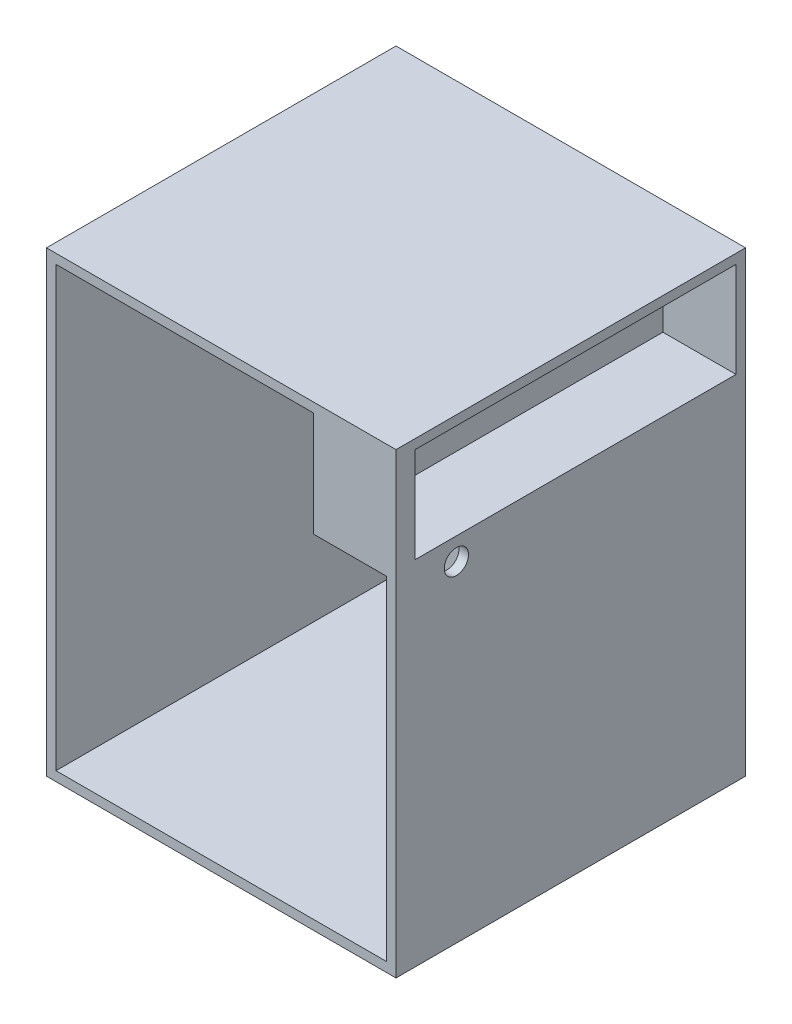
ISO-10303-21;
HEADER;
FILE_DESCRIPTION(('STEP AP214'),'2;1');
FILE_NAME('part.step','',(''),(''),'','','');
FILE_SCHEMA(('AUTOMOTIVE_DESIGN { 1 0 10303 214 1 1 1 1 }'));
ENDSEC;
DATA;
#1=APPLICATION_CONTEXT('core data for automotive mechanical design processes');
#2=APPLICATION_PROTOCOL_DEFINITION('international standard','automotive_design',2000,#1);
#3=PRODUCT_CONTEXT('',#1,'mechanical');
#4=PRODUCT('Part','Part','',(#3));
#5=PRODUCT_RELATED_PRODUCT_CATEGORY('part','',(#4));
#6=PRODUCT_DEFINITION_FORMATION('','',#4);
#7=PRODUCT_DEFINITION_CONTEXT('part definition',#1,'design');
#8=PRODUCT_DEFINITION('design','',#6,#7);
#9=PRODUCT_DEFINITION_SHAPE('','',#8);
#10=(LENGTH_UNIT() NAMED_UNIT(*) SI_UNIT(.MILLI.,.METRE.));
#11=(NAMED_UNIT(*) PLANE_ANGLE_UNIT() SI_UNIT($,.RADIAN.));
#12=(NAMED_UNIT(*) SI_UNIT($,.STERADIAN.) SOLID_ANGLE_UNIT());
#13=UNCERTAINTY_MEASURE_WITH_UNIT(LENGTH_MEASURE(1.E-05),#10,'distance_accuracy_value','');
#14=(GEOMETRIC_REPRESENTATION_CONTEXT(3) GLOBAL_UNCERTAINTY_ASSIGNED_CONTEXT((#13)) GLOBAL_UNIT_ASSIGNED_CONTEXT((#10,
#11,#12)) REPRESENTATION_CONTEXT('',''));
#15=CARTESIAN_POINT('',(0.,0.,0.));
#16=DIRECTION('',(0.,0.,1.));
#17=DIRECTION('',(1.,0.,0.));
#18=AXIS2_PLACEMENT_3D('',#15,#16,#17);
#19=CARTESIAN_POINT('',(260.,720.,275.));
#20=DIRECTION('',(-1.,0.,0.));
#21=DIRECTION('',(0.,0.,1.));
#22=AXIS2_PLACEMENT_3D('',#19,#20,#21);
#23=PLANE('',#22);
#24=DIRECTION('',(0.,0.,1.));
#25=VECTOR('',#24,1.);
#26=CARTESIAN_POINT('',(260.,555.,-260.));
#27=LINE('',#26,#25);
#28=CARTESIAN_POINT('',(260.,555.,245.));
#29=VERTEX_POINT('',#28);
#30=CARTESIAN_POINT('',(260.,555.,260.));
#31=VERTEX_POINT('',#30);
#32=EDGE_CURVE('E175',#29,#31,#27,.T.);
#33=ORIENTED_EDGE('',*,*,#32,.T.);
#34=DIRECTION('',(0.,1.,0.));
#35=VECTOR('',#34,1.);
#36=CARTESIAN_POINT('',(260.,705.,260.));
#37=LINE('',#36,#35);
#38=CARTESIAN_POINT('',(260.,705.,260.));
#39=VERTEX_POINT('',#38);
#40=EDGE_CURVE('E62',#31,#39,#37,.T.);
#41=ORIENTED_EDGE('',*,*,#40,.T.);
#42=DIRECTION('',(0.,0.,-1.));
#43=VECTOR('',#42,1.);
#44=CARTESIAN_POINT('',(260.,705.,275.));
#45=LINE('',#44,#43);
#46=CARTESIAN_POINT('',(260.,705.,245.));
#47=VERTEX_POINT('',#46);
#48=EDGE_CURVE('E172',#39,#47,#45,.T.);
#49=ORIENTED_EDGE('',*,*,#48,.T.);
#50=DIRECTION('',(0.,1.,0.));
#51=VECTOR('',#50,1.);
#52=CARTESIAN_POINT('',(260.,720.,245.));
#53=LINE('',#52,#51);
#54=EDGE_CURVE('E281',#29,#47,#53,.T.);
#55=ORIENTED_EDGE('',*,*,#54,.F.);
#56=EDGE_LOOP('',(#33,#41,#49,#55));
#57=FACE_BOUND('',#56,.T.);
#58=ADVANCED_FACE('F44',(#57),#23,.T.);
#59=CARTESIAN_POINT('',(0.,705.,0.));
#60=DIRECTION('',(0.,1.,0.));
#61=DIRECTION('',(0.,0.,1.));
#62=AXIS2_PLACEMENT_3D('',#59,#60,#61);
#63=PLANE('',#62);
#64=DIRECTION('',(-1.,0.,0.));
#65=VECTOR('',#64,1.);
#66=CARTESIAN_POINT('',(260.,705.,260.));
#67=LINE('',#66,#65);
#68=CARTESIAN_POINT('',(160.,705.,260.));
#69=VERTEX_POINT('',#68);
#70=EDGE_CURVE('E158',#39,#69,#67,.T.);
#71=ORIENTED_EDGE('',*,*,#70,.T.);
#72=DIRECTION('',(0.,0.,1.));
#73=VECTOR('',#72,1.);
#74=CARTESIAN_POINT('',(160.,705.,-260.));
#75=LINE('',#74,#73);
#76=CARTESIAN_POINT('',(160.,705.,-260.));
#77=VERTEX_POINT('',#76);
#78=EDGE_CURVE('E309',#77,#69,#75,.T.);
#79=ORIENTED_EDGE('',*,*,#78,.F.);
#80=DIRECTION('',(-1.,0.,0.));
#81=VECTOR('',#80,1.);
#82=CARTESIAN_POINT('',(275.,705.,-260.));
#83=LINE('',#82,#81);
#84=CARTESIAN_POINT('',(275.,705.,-260.));
#85=VERTEX_POINT('',#84);
#86=EDGE_CURVE('E188',#85,#77,#83,.T.);
#87=ORIENTED_EDGE('',*,*,#86,.F.);
#88=DIRECTION('',(0.,0.,1.));
#89=VECTOR('',#88,1.);
#90=CARTESIAN_POINT('',(275.,705.,245.));
#91=LINE('',#90,#89);
#92=CARTESIAN_POINT('',(275.,705.,245.));
#93=VERTEX_POINT('',#92);
#94=EDGE_CURVE('E275',#85,#93,#91,.T.);
#95=ORIENTED_EDGE('',*,*,#94,.T.);
#96=DIRECTION('',(1.,0.,0.));
#97=VECTOR('',#96,1.);
#98=CARTESIAN_POINT('',(-366.806416058119,705.,245.));
#99=LINE('',#98,#97);
#100=EDGE_CURVE('E181',#47,#93,#99,.T.);
#101=ORIENTED_EDGE('',*,*,#100,.F.);
#102=ORIENTED_EDGE('',*,*,#48,.F.);
#103=EDGE_LOOP('',(#71,#79,#87,#95,#101,#102));
#104=FACE_BOUND('',#103,.T.);
#105=ADVANCED_FACE('F179',(#104),#63,.F.);
#106=CARTESIAN_POINT('',(160.,705.,-260.));
#107=DIRECTION('',(1.,0.,0.));
#108=DIRECTION('',(0.,1.,0.));
#109=AXIS2_PLACEMENT_3D('',#106,#107,#108);
#110=PLANE('',#109);
#111=ORIENTED_EDGE('',*,*,#78,.T.);
#112=DIRECTION('',(0.,1.,0.));
#113=VECTOR('',#112,1.);
#114=CARTESIAN_POINT('',(160.,705.,260.));
#115=LINE('',#114,#113);
#116=CARTESIAN_POINT('',(160.,555.,260.));
#117=VERTEX_POINT('',#116);
#118=EDGE_CURVE('E161',#117,#69,#115,.T.);
#119=ORIENTED_EDGE('',*,*,#118,.F.);
#120=DIRECTION('',(0.,0.,1.));
#121=VECTOR('',#120,1.);
#122=CARTESIAN_POINT('',(160.,555.,-260.));
#123=LINE('',#122,#121);
#124=CARTESIAN_POINT('',(160.,555.,-260.));
#125=VERTEX_POINT('',#124);
#126=EDGE_CURVE('E312',#125,#117,#123,.T.);
#127=ORIENTED_EDGE('',*,*,#126,.F.);
#128=DIRECTION('',(0.,1.,0.));
#129=VECTOR('',#128,1.);
#130=CARTESIAN_POINT('',(160.,705.,-260.));
#131=LINE('',#130,#129);
#132=EDGE_CURVE('E299',#125,#77,#131,.T.);
#133=ORIENTED_EDGE('',*,*,#132,.T.);
#134=EDGE_LOOP('',(#111,#119,#127,#133));
#135=FACE_BOUND('',#134,.T.);
#136=ADVANCED_FACE('F390',(#135),#110,.T.);
#137=CARTESIAN_POINT('',(160.,555.,-260.));
#138=DIRECTION('',(0.,1.,0.));
#139=DIRECTION('',(0.,0.,1.));
#140=AXIS2_PLACEMENT_3D('',#137,#138,#139);
#141=PLANE('',#140);
#142=ORIENTED_EDGE('',*,*,#126,.T.);
#143=DIRECTION('',(-1.,0.,0.));
#144=VECTOR('',#143,1.);
#145=CARTESIAN_POINT('',(260.,555.,260.));
#146=LINE('',#145,#144);
#147=EDGE_CURVE('E167',#31,#117,#146,.T.);
#148=ORIENTED_EDGE('',*,*,#147,.F.);
#149=ORIENTED_EDGE('',*,*,#32,.F.);
#150=DIRECTION('',(1.,0.,0.));
#151=VECTOR('',#150,1.);
#152=CARTESIAN_POINT('',(-366.806416058119,555.,245.));
#153=LINE('',#152,#151);
#154=CARTESIAN_POINT('',(275.,555.,245.));
#155=VERTEX_POINT('',#154);
#156=EDGE_CURVE('E278',#29,#155,#153,.T.);
#157=ORIENTED_EDGE('',*,*,#156,.T.);
#158=DIRECTION('',(0.,0.,-1.));
#159=VECTOR('',#158,1.);
#160=CARTESIAN_POINT('',(275.,555.,245.));
#161=LINE('',#160,#159);
#162=CARTESIAN_POINT('',(275.,555.,-260.));
#163=VERTEX_POINT('',#162);
#164=EDGE_CURVE('E267',#155,#163,#161,.T.);
#165=ORIENTED_EDGE('',*,*,#164,.T.);
#166=DIRECTION('',(-1.,0.,0.));
#167=VECTOR('',#166,1.);
#168=CARTESIAN_POINT('',(160.,555.,-260.));
#169=LINE('',#168,#167);
#170=EDGE_CURVE('E295',#163,#125,#169,.T.);
#171=ORIENTED_EDGE('',*,*,#170,.T.);
#172=EDGE_LOOP('',(#142,#148,#149,#157,#165,#171));
#173=FACE_BOUND('',#172,.T.);
#174=ADVANCED_FACE('F444',(#173),#141,.T.);
#175=CARTESIAN_POINT('',(275.,720.,-260.));
#176=DIRECTION('',(0.,0.,1.));
#177=DIRECTION('',(1.,0.,0.));
#178=AXIS2_PLACEMENT_3D('',#175,#176,#177);
#179=PLANE('',#178);
#180=ORIENTED_EDGE('',*,*,#132,.F.);
#181=ORIENTED_EDGE('',*,*,#170,.F.);
#182=DIRECTION('',(0.,1.,0.));
#183=VECTOR('',#182,1.);
#184=CARTESIAN_POINT('',(275.,705.,-260.));
#185=LINE('',#184,#183);
#186=EDGE_CURVE('E271',#163,#85,#185,.T.);
#187=ORIENTED_EDGE('',*,*,#186,.T.);
#188=ORIENTED_EDGE('',*,*,#86,.T.);
#189=EDGE_LOOP('',(#180,#181,#187,#188));
#190=FACE_BOUND('',#189,.T.);
#191=ADVANCED_FACE('F400',(#190),#179,.T.);
#192=CARTESIAN_POINT('',(275.,720.,275.));
#193=DIRECTION('',(0.,0.,-1.));
#194=DIRECTION('',(-1.,0.,0.));
#195=AXIS2_PLACEMENT_3D('',#192,#193,#194);
#196=PLANE('',#195);
#197=DIRECTION('',(1.,0.,0.));
#198=VECTOR('',#197,1.);
#199=CARTESIAN_POINT('',(275.,0.,275.));
#200=LINE('',#199,#198);
#201=CARTESIAN_POINT('',(-275.,0.,275.));
#202=VERTEX_POINT('',#201);
#203=CARTESIAN_POINT('',(275.,0.,275.));
#204=VERTEX_POINT('',#203);
#205=EDGE_CURVE('E228',#202,#204,#200,.T.);
#206=ORIENTED_EDGE('',*,*,#205,.T.);
#207=DIRECTION('',(0.,-1.,0.));
#208=VECTOR('',#207,1.);
#209=CARTESIAN_POINT('',(275.,720.,275.));
#210=LINE('',#209,#208);
#211=CARTESIAN_POINT('',(275.,720.,275.));
#212=VERTEX_POINT('',#211);
#213=EDGE_CURVE('E54',#212,#204,#210,.T.);
#214=ORIENTED_EDGE('',*,*,#213,.F.);
#215=DIRECTION('',(1.,0.,0.));
#216=VECTOR('',#215,1.);
#217=CARTESIAN_POINT('',(275.,720.,275.));
#218=LINE('',#217,#216);
#219=CARTESIAN_POINT('',(-275.,720.,275.));
#220=VERTEX_POINT('',#219);
#221=EDGE_CURVE('E214',#220,#212,#218,.T.);
#222=ORIENTED_EDGE('',*,*,#221,.F.);
#223=DIRECTION('',(0.,-1.,0.));
#224=VECTOR('',#223,1.);
#225=CARTESIAN_POINT('',(-275.,720.,275.));
#226=LINE('',#225,#224);
#227=EDGE_CURVE('E11',#220,#202,#226,.T.);
#228=ORIENTED_EDGE('',*,*,#227,.T.);
#229=EDGE_LOOP('',(#206,#214,#222,#228));
#230=FACE_BOUND('',#229,.T.);
#231=DIRECTION('',(1.,0.,0.));
#232=VECTOR('',#231,1.);
#233=CARTESIAN_POINT('',(275.,15.,275.));
#234=LINE('',#233,#232);
#235=CARTESIAN_POINT('',(-260.,15.,275.));
#236=VERTEX_POINT('',#235);
#237=CARTESIAN_POINT('',(260.,15.,275.));
#238=VERTEX_POINT('',#237);
#239=EDGE_CURVE('E202',#236,#238,#234,.T.);
#240=ORIENTED_EDGE('',*,*,#239,.F.);
#241=DIRECTION('',(0.,-1.,0.));
#242=VECTOR('',#241,1.);
#243=CARTESIAN_POINT('',(-260.,720.,275.));
#244=LINE('',#243,#242);
#245=CARTESIAN_POINT('',(-260.,705.,275.));
#246=VERTEX_POINT('',#245);
#247=EDGE_CURVE('E197',#246,#236,#244,.T.);
#248=ORIENTED_EDGE('',*,*,#247,.F.);
#249=DIRECTION('',(1.,0.,0.));
#250=VECTOR('',#249,1.);
#251=CARTESIAN_POINT('',(275.,705.,275.));
#252=LINE('',#251,#250);
#253=CARTESIAN_POINT('',(145.,705.,275.));
#254=VERTEX_POINT('',#253);
#255=EDGE_CURVE('E184',#246,#254,#252,.T.);
#256=ORIENTED_EDGE('',*,*,#255,.T.);
#257=DIRECTION('',(0.,-1.,0.));
#258=VECTOR('',#257,1.);
#259=CARTESIAN_POINT('',(145.,705.,275.));
#260=LINE('',#259,#258);
#261=CARTESIAN_POINT('',(145.,540.,275.));
#262=VERTEX_POINT('',#261);
#263=EDGE_CURVE('E286',#254,#262,#260,.T.);
#264=ORIENTED_EDGE('',*,*,#263,.T.);
#265=DIRECTION('',(1.,0.,0.));
#266=VECTOR('',#265,1.);
#267=CARTESIAN_POINT('',(145.,540.,275.));
#268=LINE('',#267,#266);
#269=CARTESIAN_POINT('',(260.,540.,275.));
#270=VERTEX_POINT('',#269);
#271=EDGE_CURVE('E292',#262,#270,#268,.T.);
#272=ORIENTED_EDGE('',*,*,#271,.T.);
#273=DIRECTION('',(0.,-1.,0.));
#274=VECTOR('',#273,1.);
#275=CARTESIAN_POINT('',(260.,720.,275.));
#276=LINE('',#275,#274);
#277=EDGE_CURVE('E201',#270,#238,#276,.T.);
#278=ORIENTED_EDGE('',*,*,#277,.T.);
#279=EDGE_LOOP('',(#240,#248,#256,#264,#272,#278));
#280=FACE_BOUND('',#279,.T.);
#281=ADVANCED_FACE('F365',(#230,#280),#196,.F.);
#282=CARTESIAN_POINT('',(-275.,720.,275.));
#283=DIRECTION('',(1.,0.,0.));
#284=DIRECTION('',(0.,0.,-1.));
#285=AXIS2_PLACEMENT_3D('',#282,#283,#284);
#286=PLANE('',#285);
#287=CARTESIAN_POINT('',(-275.,520.,-180.));
#288=DIRECTION('',(-1.,0.,0.));
#289=DIRECTION('',(0.,0.,1.));
#290=AXIS2_PLACEMENT_3D('',#287,#288,#289);
#291=CIRCLE('',#290,19.05);
#292=CARTESIAN_POINT('',(-275.,520.,-160.95));
#293=VERTEX_POINT('',#292);
#294=EDGE_CURVE('E248',#293,#293,#291,.T.);
#295=ORIENTED_EDGE('',*,*,#294,.F.);
#296=EDGE_LOOP('',(#295));
#297=FACE_BOUND('',#296,.T.);
#298=DIRECTION('',(0.,0.,1.));
#299=VECTOR('',#298,1.);
#300=CARTESIAN_POINT('',(-275.,0.,275.));
#301=LINE('',#300,#299);
#302=CARTESIAN_POINT('',(-275.,0.,-275.));
#303=VERTEX_POINT('',#302);
#304=EDGE_CURVE('E200',#303,#202,#301,.T.);
#305=ORIENTED_EDGE('',*,*,#304,.T.);
#306=ORIENTED_EDGE('',*,*,#227,.F.);
#307=DIRECTION('',(0.,0.,1.));
#308=VECTOR('',#307,1.);
#309=CARTESIAN_POINT('',(-275.,720.,275.));
#310=LINE('',#309,#308);
#311=CARTESIAN_POINT('',(-275.,720.,-275.));
#312=VERTEX_POINT('',#311);
#313=EDGE_CURVE('E210',#312,#220,#310,.T.);
#314=ORIENTED_EDGE('',*,*,#313,.F.);
#315=DIRECTION('',(0.,-1.,0.));
#316=VECTOR('',#315,1.);
#317=CARTESIAN_POINT('',(-275.,720.,-275.));
#318=LINE('',#317,#316);
#319=EDGE_CURVE('E224',#312,#303,#318,.T.);
#320=ORIENTED_EDGE('',*,*,#319,.T.);
#321=EDGE_LOOP('',(#305,#306,#314,#320));
#322=FACE_BOUND('',#321,.T.);
#323=ADVANCED_FACE('F46',(#297,#322),#286,.F.);
#324=CARTESIAN_POINT('',(275.,720.,275.));
#325=DIRECTION('',(-1.,0.,0.));
#326=DIRECTION('',(0.,0.,1.));
#327=AXIS2_PLACEMENT_3D('',#324,#325,#326);
#328=PLANE('',#327);
#329=CARTESIAN_POINT('',(275.,520.,180.));
#330=DIRECTION('',(1.,0.,0.));
#331=DIRECTION('',(0.,0.,-1.));
#332=AXIS2_PLACEMENT_3D('',#329,#330,#331);
#333=CIRCLE('',#332,19.05);
#334=CARTESIAN_POINT('',(275.,520.,160.95));
#335=VERTEX_POINT('',#334);
#336=EDGE_CURVE('E260',#335,#335,#333,.T.);
#337=ORIENTED_EDGE('',*,*,#336,.F.);
#338=EDGE_LOOP('',(#337));
#339=FACE_BOUND('',#338,.T.);
#340=ORIENTED_EDGE('',*,*,#164,.F.);
#341=DIRECTION('',(0.,-1.,0.));
#342=VECTOR('',#341,1.);
#343=CARTESIAN_POINT('',(275.,705.,245.));
#344=LINE('',#343,#342);
#345=EDGE_CURVE('E70',#93,#155,#344,.T.);
#346=ORIENTED_EDGE('',*,*,#345,.F.);
#347=ORIENTED_EDGE('',*,*,#94,.F.);
#348=ORIENTED_EDGE('',*,*,#186,.F.);
#349=EDGE_LOOP('',(#340,#346,#347,#348));
#350=FACE_BOUND('',#349,.T.);
#351=DIRECTION('',(0.,0.,-1.));
#352=VECTOR('',#351,1.);
#353=CARTESIAN_POINT('',(275.,0.,275.));
#354=LINE('',#353,#352);
#355=CARTESIAN_POINT('',(275.,0.,-275.));
#356=VERTEX_POINT('',#355);
#357=EDGE_CURVE('E231',#204,#356,#354,.T.);
#358=ORIENTED_EDGE('',*,*,#357,.T.);
#359=DIRECTION('',(0.,-1.,0.));
#360=VECTOR('',#359,1.);
#361=CARTESIAN_POINT('',(275.,720.,-275.));
#362=LINE('',#361,#360);
#363=CARTESIAN_POINT('',(275.,720.,-275.));
#364=VERTEX_POINT('',#363);
#365=EDGE_CURVE('E239',#364,#356,#362,.T.);
#366=ORIENTED_EDGE('',*,*,#365,.F.);
#367=DIRECTION('',(0.,0.,-1.));
#368=VECTOR('',#367,1.);
#369=CARTESIAN_POINT('',(275.,720.,275.));
#370=LINE('',#369,#368);
#371=EDGE_CURVE('E218',#212,#364,#370,.T.);
#372=ORIENTED_EDGE('',*,*,#371,.F.);
#373=ORIENTED_EDGE('',*,*,#213,.T.);
#374=EDGE_LOOP('',(#358,#366,#372,#373));
#375=FACE_BOUND('',#374,.T.);
#376=ADVANCED_FACE('F414',(#339,#350,#375),#328,.F.);
#377=CARTESIAN_POINT('',(275.,720.,-275.));
#378=DIRECTION('',(0.,0.,1.));
#379=DIRECTION('',(1.,0.,0.));
#380=AXIS2_PLACEMENT_3D('',#377,#378,#379);
#381=PLANE('',#380);
#382=DIRECTION('',(-1.,0.,0.));
#383=VECTOR('',#382,1.);
#384=CARTESIAN_POINT('',(275.,0.,-275.));
#385=LINE('',#384,#383);
#386=EDGE_CURVE('E215',#356,#303,#385,.T.);
#387=ORIENTED_EDGE('',*,*,#386,.T.);
#388=ORIENTED_EDGE('',*,*,#319,.F.);
#389=DIRECTION('',(-1.,0.,0.));
#390=VECTOR('',#389,1.);
#391=CARTESIAN_POINT('',(275.,720.,-275.));
#392=LINE('',#391,#390);
#393=EDGE_CURVE('E221',#364,#312,#392,.T.);
#394=ORIENTED_EDGE('',*,*,#393,.F.);
#395=ORIENTED_EDGE('',*,*,#365,.T.);
#396=EDGE_LOOP('',(#387,#388,#394,#395));
#397=FACE_BOUND('',#396,.T.);
#398=ADVANCED_FACE('F416',(#397),#381,.F.);
#399=CARTESIAN_POINT('',(0.,720.,0.));
#400=DIRECTION('',(0.,1.,0.));
#401=DIRECTION('',(0.,0.,1.));
#402=AXIS2_PLACEMENT_3D('',#399,#400,#401);
#403=PLANE('',#402);
#404=ORIENTED_EDGE('',*,*,#313,.T.);
#405=ORIENTED_EDGE('',*,*,#221,.T.);
#406=ORIENTED_EDGE('',*,*,#371,.T.);
#407=ORIENTED_EDGE('',*,*,#393,.T.);
#408=EDGE_LOOP('',(#404,#405,#406,#407));
#409=FACE_BOUND('',#408,.T.);
#410=ADVANCED_FACE('F435',(#409),#403,.T.);
#411=CARTESIAN_POINT('',(0.,0.,0.));
#412=DIRECTION('',(0.,1.,0.));
#413=DIRECTION('',(0.,0.,1.));
#414=AXIS2_PLACEMENT_3D('',#411,#412,#413);
#415=PLANE('',#414);
#416=ORIENTED_EDGE('',*,*,#304,.F.);
#417=ORIENTED_EDGE('',*,*,#386,.F.);
#418=ORIENTED_EDGE('',*,*,#357,.F.);
#419=ORIENTED_EDGE('',*,*,#205,.F.);
#420=EDGE_LOOP('',(#416,#417,#418,#419));
#421=FACE_BOUND('',#420,.T.);
#422=ADVANCED_FACE('F402',(#421),#415,.F.);
#423=CARTESIAN_POINT('',(-260.,720.,275.));
#424=DIRECTION('',(1.,0.,0.));
#425=DIRECTION('',(0.,0.,-1.));
#426=AXIS2_PLACEMENT_3D('',#423,#424,#425);
#427=PLANE('',#426);
#428=CARTESIAN_POINT('',(-260.,520.,-180.));
#429=DIRECTION('',(1.,0.,0.));
#430=DIRECTION('',(0.,0.,-1.));
#431=AXIS2_PLACEMENT_3D('',#428,#429,#430);
#432=CIRCLE('',#431,19.05);
#433=CARTESIAN_POINT('',(-260.,520.,-199.05));
#434=VERTEX_POINT('',#433);
#435=EDGE_CURVE('E245',#434,#434,#432,.T.);
#436=ORIENTED_EDGE('',*,*,#435,.F.);
#437=EDGE_LOOP('',(#436));
#438=FACE_BOUND('',#437,.T.);
#439=DIRECTION('',(0.,0.,1.));
#440=VECTOR('',#439,1.);
#441=CARTESIAN_POINT('',(-260.,15.,275.));
#442=LINE('',#441,#440);
#443=CARTESIAN_POINT('',(-260.,15.,-260.));
#444=VERTEX_POINT('',#443);
#445=EDGE_CURVE('E206',#444,#236,#442,.T.);
#446=ORIENTED_EDGE('',*,*,#445,.F.);
#447=DIRECTION('',(0.,-1.,0.));
#448=VECTOR('',#447,1.);
#449=CARTESIAN_POINT('',(-260.,720.,-260.));
#450=LINE('',#449,#448);
#451=CARTESIAN_POINT('',(-260.,705.,-260.));
#452=VERTEX_POINT('',#451);
#453=EDGE_CURVE('E333',#452,#444,#450,.T.);
#454=ORIENTED_EDGE('',*,*,#453,.F.);
#455=DIRECTION('',(0.,0.,1.));
#456=VECTOR('',#455,1.);
#457=CARTESIAN_POINT('',(-260.,705.,275.));
#458=LINE('',#457,#456);
#459=EDGE_CURVE('E191',#452,#246,#458,.T.);
#460=ORIENTED_EDGE('',*,*,#459,.T.);
#461=ORIENTED_EDGE('',*,*,#247,.T.);
#462=EDGE_LOOP('',(#446,#454,#460,#461));
#463=FACE_BOUND('',#462,.T.);
#464=ADVANCED_FACE('F362',(#438,#463),#427,.T.);
#465=CARTESIAN_POINT('',(260.,520.,180.));
#466=DIRECTION('',(-1.,0.,0.));
#467=DIRECTION('',(0.,0.,1.));
#468=AXIS2_PLACEMENT_3D('',#465,#466,#467);
#469=CIRCLE('',#468,19.05);
#470=CARTESIAN_POINT('',(260.,520.,199.05));
#471=VERTEX_POINT('',#470);
#472=EDGE_CURVE('E48',#471,#471,#469,.T.);
#473=ORIENTED_EDGE('',*,*,#472,.F.);
#474=EDGE_LOOP('',(#473));
#475=FACE_BOUND('',#474,.T.);
#476=DIRECTION('',(0.,0.,1.));
#477=VECTOR('',#476,1.);
#478=CARTESIAN_POINT('',(260.,540.,-260.));
#479=LINE('',#478,#477);
#480=CARTESIAN_POINT('',(260.,540.,-260.));
#481=VERTEX_POINT('',#480);
#482=EDGE_CURVE('E318',#481,#270,#479,.T.);
#483=ORIENTED_EDGE('',*,*,#482,.F.);
#484=DIRECTION('',(0.,-1.,0.));
#485=VECTOR('',#484,1.);
#486=CARTESIAN_POINT('',(260.,720.,-260.));
#487=LINE('',#486,#485);
#488=CARTESIAN_POINT('',(260.,15.,-260.));
#489=VERTEX_POINT('',#488);
#490=EDGE_CURVE('E208',#481,#489,#487,.T.);
#491=ORIENTED_EDGE('',*,*,#490,.T.);
#492=DIRECTION('',(0.,0.,-1.));
#493=VECTOR('',#492,1.);
#494=CARTESIAN_POINT('',(260.,15.,275.));
#495=LINE('',#494,#493);
#496=EDGE_CURVE('E195',#238,#489,#495,.T.);
#497=ORIENTED_EDGE('',*,*,#496,.F.);
#498=ORIENTED_EDGE('',*,*,#277,.F.);
#499=EDGE_LOOP('',(#483,#491,#497,#498));
#500=FACE_BOUND('',#499,.T.);
#501=ADVANCED_FACE('F346',(#475,#500),#23,.T.);
#502=DIRECTION('',(1.,0.,0.));
#503=VECTOR('',#502,1.);
#504=CARTESIAN_POINT('',(145.,540.,-260.));
#505=LINE('',#504,#503);
#506=CARTESIAN_POINT('',(145.,540.,-260.));
#507=VERTEX_POINT('',#506);
#508=EDGE_CURVE('E291',#507,#481,#505,.T.);
#509=ORIENTED_EDGE('',*,*,#508,.F.);
#510=DIRECTION('',(0.,-1.,0.));
#511=VECTOR('',#510,1.);
#512=CARTESIAN_POINT('',(145.,705.,-260.));
#513=LINE('',#512,#511);
#514=CARTESIAN_POINT('',(145.,705.,-260.));
#515=VERTEX_POINT('',#514);
#516=EDGE_CURVE('E287',#515,#507,#513,.T.);
#517=ORIENTED_EDGE('',*,*,#516,.F.);
#518=EDGE_CURVE('E183',#515,#452,#83,.T.);
#519=ORIENTED_EDGE('',*,*,#518,.T.);
#520=ORIENTED_EDGE('',*,*,#453,.T.);
#521=DIRECTION('',(-1.,0.,0.));
#522=VECTOR('',#521,1.);
#523=CARTESIAN_POINT('',(275.,15.,-260.));
#524=LINE('',#523,#522);
#525=EDGE_CURVE('E332',#489,#444,#524,.T.);
#526=ORIENTED_EDGE('',*,*,#525,.F.);
#527=ORIENTED_EDGE('',*,*,#490,.F.);
#528=EDGE_LOOP('',(#509,#517,#519,#520,#526,#527));
#529=FACE_BOUND('',#528,.T.);
#530=ADVANCED_FACE('F355',(#529),#179,.T.);
#531=ORIENTED_EDGE('',*,*,#518,.F.);
#532=DIRECTION('',(0.,0.,1.));
#533=VECTOR('',#532,1.);
#534=CARTESIAN_POINT('',(145.,705.,-260.));
#535=LINE('',#534,#533);
#536=EDGE_CURVE('E302',#515,#254,#535,.T.);
#537=ORIENTED_EDGE('',*,*,#536,.T.);
#538=ORIENTED_EDGE('',*,*,#255,.F.);
#539=ORIENTED_EDGE('',*,*,#459,.F.);
#540=EDGE_LOOP('',(#531,#537,#538,#539));
#541=FACE_BOUND('',#540,.T.);
#542=ADVANCED_FACE('F371',(#541),#63,.F.);
#543=CARTESIAN_POINT('',(0.,15.,0.));
#544=DIRECTION('',(0.,1.,0.));
#545=DIRECTION('',(0.,0.,1.));
#546=AXIS2_PLACEMENT_3D('',#543,#544,#545);
#547=PLANE('',#546);
#548=ORIENTED_EDGE('',*,*,#445,.T.);
#549=ORIENTED_EDGE('',*,*,#239,.T.);
#550=ORIENTED_EDGE('',*,*,#496,.T.);
#551=ORIENTED_EDGE('',*,*,#525,.T.);
#552=EDGE_LOOP('',(#548,#549,#550,#551));
#553=FACE_BOUND('',#552,.T.);
#554=ADVANCED_FACE('F352',(#553),#547,.T.);
#555=CARTESIAN_POINT('',(145.,540.,-260.));
#556=DIRECTION('',(0.,-1.,0.));
#557=DIRECTION('',(0.,0.,-1.));
#558=AXIS2_PLACEMENT_3D('',#555,#556,#557);
#559=PLANE('',#558);
#560=ORIENTED_EDGE('',*,*,#271,.F.);
#561=DIRECTION('',(0.,0.,1.));
#562=VECTOR('',#561,1.);
#563=CARTESIAN_POINT('',(145.,540.,-260.));
#564=LINE('',#563,#562);
#565=EDGE_CURVE('E321',#507,#262,#564,.T.);
#566=ORIENTED_EDGE('',*,*,#565,.F.);
#567=ORIENTED_EDGE('',*,*,#508,.T.);
#568=ORIENTED_EDGE('',*,*,#482,.T.);
#569=EDGE_LOOP('',(#560,#566,#567,#568));
#570=FACE_BOUND('',#569,.T.);
#571=ADVANCED_FACE('F368',(#570),#559,.T.);
#572=CARTESIAN_POINT('',(145.,705.,-260.));
#573=DIRECTION('',(-1.,0.,0.));
#574=DIRECTION('',(0.,0.,1.));
#575=AXIS2_PLACEMENT_3D('',#572,#573,#574);
#576=PLANE('',#575);
#577=ORIENTED_EDGE('',*,*,#263,.F.);
#578=ORIENTED_EDGE('',*,*,#536,.F.);
#579=ORIENTED_EDGE('',*,*,#516,.T.);
#580=ORIENTED_EDGE('',*,*,#565,.T.);
#581=EDGE_LOOP('',(#577,#578,#579,#580));
#582=FACE_BOUND('',#581,.T.);
#583=ADVANCED_FACE('F373',(#582),#576,.T.);
#584=CARTESIAN_POINT('',(-366.806416058119,705.,245.));
#585=DIRECTION('',(0.,0.,1.));
#586=DIRECTION('',(0.,-1.,0.));
#587=AXIS2_PLACEMENT_3D('',#584,#585,#586);
#588=PLANE('',#587);
#589=ORIENTED_EDGE('',*,*,#54,.T.);
#590=ORIENTED_EDGE('',*,*,#100,.T.);
#591=ORIENTED_EDGE('',*,*,#345,.T.);
#592=ORIENTED_EDGE('',*,*,#156,.F.);
#593=EDGE_LOOP('',(#589,#590,#591,#592));
#594=FACE_BOUND('',#593,.T.);
#595=ADVANCED_FACE('F375',(#594),#588,.F.);
#596=CARTESIAN_POINT('',(260.,705.,260.));
#597=DIRECTION('',(0.,0.,1.));
#598=DIRECTION('',(1.,0.,0.));
#599=AXIS2_PLACEMENT_3D('',#596,#597,#598);
#600=PLANE('',#599);
#601=ORIENTED_EDGE('',*,*,#118,.T.);
#602=ORIENTED_EDGE('',*,*,#70,.F.);
#603=ORIENTED_EDGE('',*,*,#40,.F.);
#604=ORIENTED_EDGE('',*,*,#147,.T.);
#605=EDGE_LOOP('',(#601,#602,#603,#604));
#606=FACE_BOUND('',#605,.T.);
#607=ADVANCED_FACE('F159',(#606),#600,.F.);
#608=CARTESIAN_POINT('',(-245.,520.,-180.));
#609=DIRECTION('',(-1.,0.,0.));
#610=DIRECTION('',(0.,0.,1.));
#611=AXIS2_PLACEMENT_3D('',#608,#609,#610);
#612=CYLINDRICAL_SURFACE('',#611,19.05);
#613=ORIENTED_EDGE('',*,*,#435,.T.);
#614=EDGE_LOOP('',(#613));
#615=FACE_BOUND('',#614,.T.);
#616=ORIENTED_EDGE('',*,*,#294,.T.);
#617=EDGE_LOOP('',(#616));
#618=FACE_BOUND('',#617,.T.);
#619=ADVANCED_FACE('F408',(#615,#618),#612,.F.);
#620=CARTESIAN_POINT('',(245.,520.,180.));
#621=DIRECTION('',(1.,0.,0.));
#622=DIRECTION('',(0.,0.,-1.));
#623=AXIS2_PLACEMENT_3D('',#620,#621,#622);
#624=CYLINDRICAL_SURFACE('',#623,19.05);
#625=ORIENTED_EDGE('',*,*,#472,.T.);
#626=EDGE_LOOP('',(#625));
#627=FACE_BOUND('',#626,.T.);
#628=ORIENTED_EDGE('',*,*,#336,.T.);
#629=EDGE_LOOP('',(#628));
#630=FACE_BOUND('',#629,.T.);
#631=ADVANCED_FACE('F406',(#627,#630),#624,.F.);
#632=CLOSED_SHELL('',(#58,#105,#136,#174,#191,#281,#323,#376,#398,#410,#422,#464,#501,#530,#542,
#554,#571,#583,#595,#607,#619,#631));
#633=MANIFOLD_SOLID_BREP('B2',#632);
#634=ADVANCED_BREP_SHAPE_REPRESENTATION('',(#18,#633),#14);
#635=SHAPE_DEFINITION_REPRESENTATION(#9,#634);
ENDSEC;
END-ISO-10303-21;
